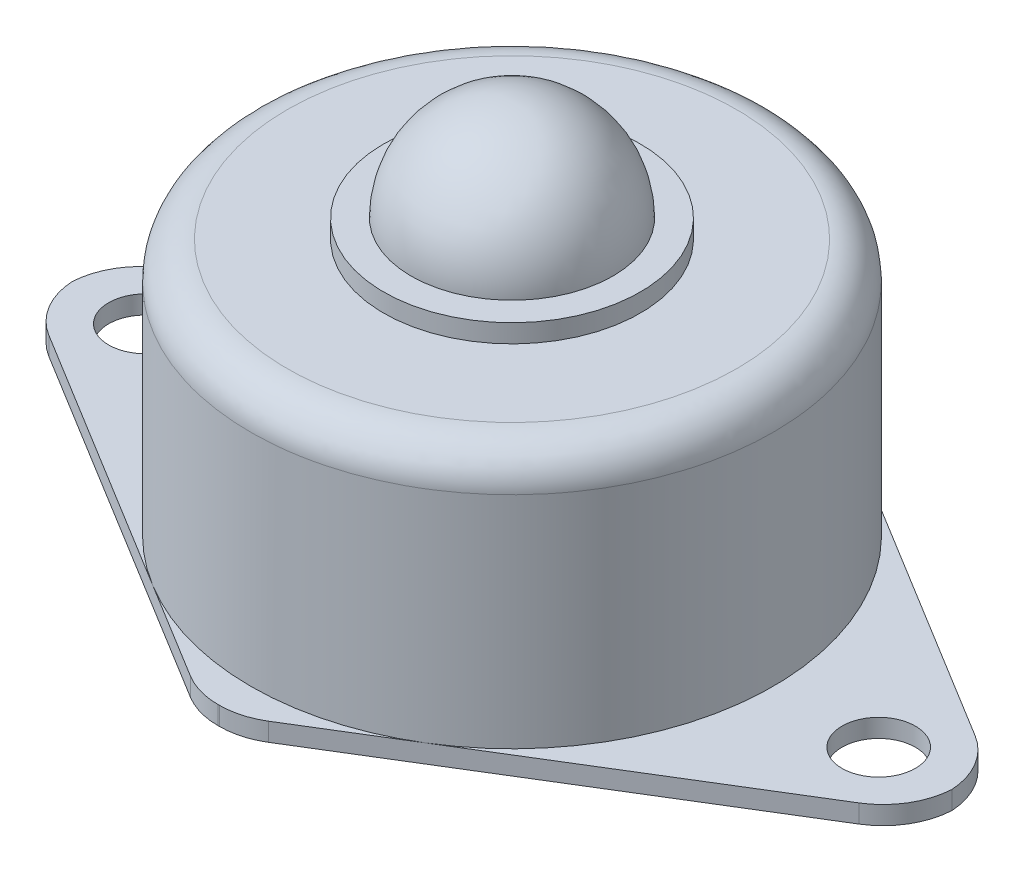
ISO-10303-21;
HEADER;
FILE_DESCRIPTION(('STEP AP214'),'2;1');
FILE_NAME('part.step','',(''),(''),'','','');
FILE_SCHEMA(('AUTOMOTIVE_DESIGN { 1 0 10303 214 1 1 1 1 }'));
ENDSEC;
DATA;
#1=APPLICATION_CONTEXT('core data for automotive mechanical design processes');
#2=APPLICATION_PROTOCOL_DEFINITION('international standard','automotive_design',2000,#1);
#3=PRODUCT_CONTEXT('',#1,'mechanical');
#4=PRODUCT('Part','Part','',(#3));
#5=PRODUCT_RELATED_PRODUCT_CATEGORY('part','',(#4));
#6=PRODUCT_DEFINITION_FORMATION('','',#4);
#7=PRODUCT_DEFINITION_CONTEXT('part definition',#1,'design');
#8=PRODUCT_DEFINITION('design','',#6,#7);
#9=PRODUCT_DEFINITION_SHAPE('','',#8);
#10=(LENGTH_UNIT() NAMED_UNIT(*) SI_UNIT(.MILLI.,.METRE.));
#11=(NAMED_UNIT(*) PLANE_ANGLE_UNIT() SI_UNIT($,.RADIAN.));
#12=(NAMED_UNIT(*) SI_UNIT($,.STERADIAN.) SOLID_ANGLE_UNIT());
#13=UNCERTAINTY_MEASURE_WITH_UNIT(LENGTH_MEASURE(1.E-05),#10,'distance_accuracy_value','');
#14=(GEOMETRIC_REPRESENTATION_CONTEXT(3) GLOBAL_UNCERTAINTY_ASSIGNED_CONTEXT((#13)) GLOBAL_UNIT_ASSIGNED_CONTEXT((#10,
#11,#12)) REPRESENTATION_CONTEXT('',''));
#15=CARTESIAN_POINT('',(0.,0.,0.));
#16=DIRECTION('',(0.,0.,1.));
#17=DIRECTION('',(1.,0.,0.));
#18=AXIS2_PLACEMENT_3D('',#15,#16,#17);
#19=CARTESIAN_POINT('',(0.,20.5,0.));
#20=DIRECTION('',(0.,1.,0.));
#21=DIRECTION('',(-1.,0.,0.));
#22=AXIS2_PLACEMENT_3D('',#19,#20,#21);
#23=CYLINDRICAL_SURFACE('',#22,14.25);
#24=CARTESIAN_POINT('',(-14.25,12.,0.));
#25=CARTESIAN_POINT('',(-14.25,12.,1.86532063653613));
#26=CARTESIAN_POINT('',(-13.8791106419374,12.,3.72990735353475));
#27=CARTESIAN_POINT('',(-12.4514560346343,12.,7.17657046887031));
#28=CARTESIAN_POINT('',(-11.3952525030937,12.,8.75729076072287));
#29=CARTESIAN_POINT('',(-8.75729076072287,12.,11.3952525030937));
#30=CARTESIAN_POINT('',(-7.1765704688717,12.,12.4514560346337));
#31=CARTESIAN_POINT('',(-3.72990735353334,12.,13.879110641938));
#32=CARTESIAN_POINT('',(-1.86532063653795,12.,14.25));
#33=CARTESIAN_POINT('',(1.86532063653795,12.,14.25));
#34=CARTESIAN_POINT('',(3.72990735353417,12.,13.8791106419376));
#35=CARTESIAN_POINT('',(7.17657046887091,12.,12.451456034634));
#36=CARTESIAN_POINT('',(8.75729076072659,12.,11.39525250309));
#37=CARTESIAN_POINT('',(11.39525250309,12.,8.75729076072657));
#38=CARTESIAN_POINT('',(12.4514560346343,12.,7.17657046887035));
#39=CARTESIAN_POINT('',(13.8791106419374,12.,3.72990735353475));
#40=CARTESIAN_POINT('',(14.25,12.,1.86532063653205));
#41=CARTESIAN_POINT('',(14.25,12.,-1.86532063653205));
#42=CARTESIAN_POINT('',(13.8791106419372,12.,-3.72990735353528));
#43=CARTESIAN_POINT('',(12.4514560346345,12.,-7.17657046886973));
#44=CARTESIAN_POINT('',(11.3952525030949,11.9999999999984,-8.75729076072172));
#45=CARTESIAN_POINT('',(8.75729076072173,12.0000000000016,-11.3952525030949));
#46=CARTESIAN_POINT('',(7.17657046885975,12.,-12.4514560346387));
#47=CARTESIAN_POINT('',(3.72990735354535,12.,-13.879110641933));
#48=CARTESIAN_POINT('',(1.86532063653793,12.,-14.25));
#49=CARTESIAN_POINT('',(-1.86532063653797,12.,-14.25));
#50=CARTESIAN_POINT('',(-3.72990735353404,12.,-13.8791106419377));
#51=CARTESIAN_POINT('',(-7.17657046887097,12.,-12.451456034634));
#52=CARTESIAN_POINT('',(-8.75729076072628,12.,-11.3952525030903));
#53=CARTESIAN_POINT('',(-11.3952525030903,12.,-8.75729076072635));
#54=CARTESIAN_POINT('',(-12.4514560346342,12.,-7.17657046887044));
#55=CARTESIAN_POINT('',(-13.8791106419374,12.,-3.72990735353466));
#56=CARTESIAN_POINT('',(-14.25,12.,-1.86532063653613));
#57=CARTESIAN_POINT('',(-14.25,12.,0.));
#58=(BOUNDED_CURVE() B_SPLINE_CURVE(3,(#24,#25,#26,#27,#28,#29,#30,#31,#32,#33,#34,#35,#36,#37,
#38,#39,#40,#41,#42,#43,#44,#45,#46,#47,#48,#49,#50,#51,#52,#53,#54,#55,#56,#57),.UNSPECIFIED.,
.T.,.F.) B_SPLINE_CURVE_WITH_KNOTS((4,2,2,2,2,2,2,2,2,2,2,2,2,2,2,2,4),(0.,0.392699081698724,
0.785398163397448,1.17809724509617,1.5707963267949,1.96349540849362,2.35619449019234,
2.74889357189107,3.14159265358979,3.53429173528852,3.92699081698724,4.31968989868597,
4.71238898038469,5.10508806208341,5.49778714378214,5.89048622548086,6.28318530717959),
.UNSPECIFIED.) CURVE() GEOMETRIC_REPRESENTATION_ITEM() RATIONAL_B_SPLINE_CURVE((1.,1.,1.,1.,1.,
1.,1.,1.,1.,1.,1.,1.,1.,1.,1.,1.,1.,1.,1.,1.,1.,1.,1.,1.,1.,1.,1.,1.,1.,1.,1.,1.,1.,1.)) REPRESENTATION_ITEM(''));
#59=CARTESIAN_POINT('',(-14.25,12.,0.));
#60=VERTEX_POINT('',#59);
#61=EDGE_CURVE('E190',#60,#60,#58,.F.);
#62=ORIENTED_EDGE('',*,*,#61,.T.);
#63=EDGE_LOOP('',(#62));
#64=FACE_BOUND('',#63,.T.);
#65=CARTESIAN_POINT('',(0.,0.,0.));
#66=DIRECTION('',(0.,1.,0.));
#67=DIRECTION('',(-1.,0.,0.));
#68=AXIS2_PLACEMENT_3D('',#65,#66,#67);
#69=CIRCLE('',#68,14.25);
#70=CARTESIAN_POINT('',(-7.44857925519382,0.,12.1482989376742));
#71=VERTEX_POINT('',#70);
#72=CARTESIAN_POINT('',(7.44857925519382,0.,12.1482989376742));
#73=VERTEX_POINT('',#72);
#74=EDGE_CURVE('E175',#71,#73,#69,.T.);
#75=ORIENTED_EDGE('',*,*,#74,.T.);
#76=CARTESIAN_POINT('',(7.44857925519382,0.,-12.1482989376742));
#77=VERTEX_POINT('',#76);
#78=EDGE_CURVE('E167',#73,#77,#69,.T.);
#79=ORIENTED_EDGE('',*,*,#78,.T.);
#80=CARTESIAN_POINT('',(-7.44857925519382,0.,-12.1482989376742));
#81=VERTEX_POINT('',#80);
#82=EDGE_CURVE('E176',#77,#81,#69,.T.);
#83=ORIENTED_EDGE('',*,*,#82,.T.);
#84=EDGE_CURVE('E187',#81,#71,#69,.T.);
#85=ORIENTED_EDGE('',*,*,#84,.T.);
#86=EDGE_LOOP('',(#75,#79,#83,#85));
#87=FACE_BOUND('',#86,.T.);
#88=ADVANCED_FACE('F37',(#64,#87),#23,.T.);
#89=CARTESIAN_POINT('',(-7.00000000000001,14.,0.));
#90=DIRECTION('',(0.,1.,0.));
#91=DIRECTION('',(-1.,0.,0.));
#92=AXIS2_PLACEMENT_3D('',#89,#90,#91);
#93=PLANE('',#92);
#94=CARTESIAN_POINT('',(-12.25,14.,0.));
#95=CARTESIAN_POINT('',(-12.25,14.,-1.60352124895212));
#96=CARTESIAN_POINT('',(-11.9311652886827,14.,-3.20641158461705));
#97=CARTESIAN_POINT('',(-10.7038832578438,14.,-6.16933250832768));
#98=CARTESIAN_POINT('',(-9.79591881844689,14.,-7.52819732062353));
#99=CARTESIAN_POINT('',(-7.52819732062347,14.,-9.79591881844694));
#100=CARTESIAN_POINT('',(-6.16933250832764,14.,-10.7038832578422));
#101=CARTESIAN_POINT('',(-3.20641158461702,14.,-11.9311652886843));
#102=CARTESIAN_POINT('',(-1.60352124895408,14.,-12.25));
#103=CARTESIAN_POINT('',(1.60352124895404,14.,-12.25));
#104=CARTESIAN_POINT('',(3.20641158461786,14.,-11.9311652886827));
#105=CARTESIAN_POINT('',(6.16933250832687,14.,-10.7038832578438));
#106=CARTESIAN_POINT('',(7.52819732062096,14.,-9.79591881844622));
#107=CARTESIAN_POINT('',(9.79591881844945,14.,-7.52819732062421));
#108=CARTESIAN_POINT('',(10.7038832578445,14.,-6.16933250832798));
#109=CARTESIAN_POINT('',(11.9311652886821,14.,-3.20641158461669));
#110=CARTESIAN_POINT('',(12.25,14.,-1.60352124895367));
#111=CARTESIAN_POINT('',(12.25,14.,1.60352124895368));
#112=CARTESIAN_POINT('',(11.9311652886821,14.,3.20641158461753));
#113=CARTESIAN_POINT('',(10.7038832578445,14.,6.1693325083272));
#114=CARTESIAN_POINT('',(9.79591881844622,14.,7.5281973206242));
#115=CARTESIAN_POINT('',(7.52819732062421,14.,9.79591881844621));
#116=CARTESIAN_POINT('',(6.16933250832719,14.,10.7038832578428));
#117=CARTESIAN_POINT('',(3.20641158461752,14.,11.9311652886837));
#118=CARTESIAN_POINT('',(1.60352124895362,14.,12.25));
#119=CARTESIAN_POINT('',(-1.60352124895361,14.,12.25));
#120=CARTESIAN_POINT('',(-3.20641158461589,14.,11.9311652886821));
#121=CARTESIAN_POINT('',(-6.1693325083288,14.,10.7038832578445));
#122=CARTESIAN_POINT('',(-7.52819732062241,14.,9.79591881844801));
#123=CARTESIAN_POINT('',(-9.79591881844801,14.,7.52819732062241));
#124=CARTESIAN_POINT('',(-10.703883257844,14.,6.16933250832755));
#125=CARTESIAN_POINT('',(-11.9311652886826,14.,3.20641158461715));
#126=CARTESIAN_POINT('',(-12.25,14.,1.60352124895211));
#127=CARTESIAN_POINT('',(-12.25,14.,0.));
#128=(BOUNDED_CURVE() B_SPLINE_CURVE(3,(#94,#95,#96,#97,#98,#99,#100,#101,#102,#103,#104,#105,
#106,#107,#108,#109,#110,#111,#112,#113,#114,#115,#116,#117,#118,#119,#120,#121,#122,#123,#124,
#125,#126,#127),.UNSPECIFIED.,.T.,.F.) B_SPLINE_CURVE_WITH_KNOTS((4,2,2,2,2,2,2,2,2,2,2,2,2,2,2,
2,4),(0.,0.392699081698725,0.785398163397448,1.17809724509617,1.5707963267949,1.96349540849362,
2.35619449019234,2.74889357189107,3.14159265358979,3.53429173528852,3.92699081698724,
4.31968989868597,4.71238898038469,5.10508806208341,5.49778714378214,5.89048622548086,
6.28318530717959),
.UNSPECIFIED.) CURVE() GEOMETRIC_REPRESENTATION_ITEM() RATIONAL_B_SPLINE_CURVE((1.,1.,1.,1.,1.,
1.,1.,1.,1.,1.,1.,1.,1.,1.,1.,1.,1.,1.,1.,1.,1.,1.,1.,1.,1.,1.,1.,1.,1.,1.,1.,1.,1.,1.)) REPRESENTATION_ITEM(''));
#129=CARTESIAN_POINT('',(-12.25,14.,0.));
#130=VERTEX_POINT('',#129);
#131=EDGE_CURVE('E188',#130,#130,#128,.F.);
#132=ORIENTED_EDGE('',*,*,#131,.T.);
#133=EDGE_LOOP('',(#132));
#134=FACE_BOUND('',#133,.T.);
#135=CARTESIAN_POINT('',(0.,14.,0.));
#136=DIRECTION('',(0.,1.,0.));
#137=DIRECTION('',(-1.,0.,0.));
#138=AXIS2_PLACEMENT_3D('',#135,#136,#137);
#139=CIRCLE('',#138,7.00000000000001);
#140=CARTESIAN_POINT('',(-7.00000000000001,14.,0.));
#141=VERTEX_POINT('',#140);
#142=EDGE_CURVE('E193',#141,#141,#139,.T.);
#143=ORIENTED_EDGE('',*,*,#142,.F.);
#144=EDGE_LOOP('',(#143));
#145=FACE_BOUND('',#144,.T.);
#146=ADVANCED_FACE('F357',(#134,#145),#93,.T.);
#147=CARTESIAN_POINT('',(0.,20.5,0.));
#148=DIRECTION('',(0.,1.,0.));
#149=DIRECTION('',(-1.,0.,0.));
#150=AXIS2_PLACEMENT_3D('',#147,#148,#149);
#151=CYLINDRICAL_SURFACE('',#150,7.00000000000001);
#152=ORIENTED_EDGE('',*,*,#142,.T.);
#153=EDGE_LOOP('',(#152));
#154=FACE_BOUND('',#153,.T.);
#155=CARTESIAN_POINT('',(0.,15.,0.));
#156=DIRECTION('',(0.,1.,0.));
#157=DIRECTION('',(-1.,0.,0.));
#158=AXIS2_PLACEMENT_3D('',#155,#156,#157);
#159=CIRCLE('',#158,7.00000000000001);
#160=CARTESIAN_POINT('',(-7.00000000000001,15.,0.));
#161=VERTEX_POINT('',#160);
#162=EDGE_CURVE('E195',#161,#161,#159,.T.);
#163=ORIENTED_EDGE('',*,*,#162,.F.);
#164=EDGE_LOOP('',(#163));
#165=FACE_BOUND('',#164,.T.);
#166=ADVANCED_FACE('F363',(#154,#165),#151,.T.);
#167=CARTESIAN_POINT('',(-5.50000000000001,15.,0.));
#168=DIRECTION('',(0.,1.,0.));
#169=DIRECTION('',(-1.,0.,0.));
#170=AXIS2_PLACEMENT_3D('',#167,#168,#169);
#171=PLANE('',#170);
#172=ORIENTED_EDGE('',*,*,#162,.T.);
#173=EDGE_LOOP('',(#172));
#174=FACE_BOUND('',#173,.T.);
#175=CARTESIAN_POINT('',(0.,15.,0.));
#176=DIRECTION('',(0.,1.,0.));
#177=DIRECTION('',(-1.,0.,0.));
#178=AXIS2_PLACEMENT_3D('',#175,#176,#177);
#179=CIRCLE('',#178,5.50000000000001);
#180=CARTESIAN_POINT('',(-5.50000000000001,15.,0.));
#181=VERTEX_POINT('',#180);
#182=EDGE_CURVE('E199',#181,#181,#179,.T.);
#183=ORIENTED_EDGE('',*,*,#182,.F.);
#184=EDGE_LOOP('',(#183));
#185=FACE_BOUND('',#184,.T.);
#186=ADVANCED_FACE('F405',(#174,#185),#171,.T.);
#187=CARTESIAN_POINT('',(0.,15.,0.));
#188=DIRECTION('',(0.,1.,0.));
#189=DIRECTION('',(1.,0.,0.));
#190=AXIS2_PLACEMENT_3D('',#187,#188,#189);
#191=SPHERICAL_SURFACE('',#190,5.5);
#192=ORIENTED_EDGE('',*,*,#182,.T.);
#193=EDGE_LOOP('',(#192));
#194=FACE_BOUND('',#193,.T.);
#195=ADVANCED_FACE('F398',(#194),#191,.T.);
#196=CARTESIAN_POINT('',(-12.25,14.,0.));
#197=CARTESIAN_POINT('',(-12.25,14.,1.60352124895211));
#198=CARTESIAN_POINT('',(-11.9311652886826,14.,3.20641158461715));
#199=CARTESIAN_POINT('',(-10.703883257844,14.,6.16933250832755));
#200=CARTESIAN_POINT('',(-9.79591881844801,14.,7.52819732062241));
#201=CARTESIAN_POINT('',(-7.52819732062241,14.,9.79591881844801));
#202=CARTESIAN_POINT('',(-6.1693325083288,14.,10.7038832578445));
#203=CARTESIAN_POINT('',(-3.20641158461589,14.,11.9311652886821));
#204=CARTESIAN_POINT('',(-1.60352124895361,14.,12.25));
#205=CARTESIAN_POINT('',(1.60352124895362,14.,12.25));
#206=CARTESIAN_POINT('',(3.20641158461752,14.,11.9311652886837));
#207=CARTESIAN_POINT('',(6.16933250832719,14.,10.7038832578428));
#208=CARTESIAN_POINT('',(7.52819732062421,14.,9.79591881844621));
#209=CARTESIAN_POINT('',(9.79591881844622,14.,7.5281973206242));
#210=CARTESIAN_POINT('',(10.7038832578445,14.,6.1693325083272));
#211=CARTESIAN_POINT('',(11.9311652886821,14.,3.20641158461753));
#212=CARTESIAN_POINT('',(12.25,14.,1.60352124895368));
#213=CARTESIAN_POINT('',(12.25,14.,-1.60352124895367));
#214=CARTESIAN_POINT('',(11.9311652886821,14.,-3.20641158461669));
#215=CARTESIAN_POINT('',(10.7038832578445,14.,-6.16933250832798));
#216=CARTESIAN_POINT('',(9.79591881844945,14.,-7.52819732062421));
#217=CARTESIAN_POINT('',(7.52819732062096,14.,-9.79591881844622));
#218=CARTESIAN_POINT('',(6.16933250832687,14.,-10.7038832578438));
#219=CARTESIAN_POINT('',(3.20641158461786,14.,-11.9311652886827));
#220=CARTESIAN_POINT('',(1.60352124895404,14.,-12.25));
#221=CARTESIAN_POINT('',(-1.60352124895408,14.,-12.25));
#222=CARTESIAN_POINT('',(-3.20641158461702,14.,-11.9311652886843));
#223=CARTESIAN_POINT('',(-6.16933250832764,14.,-10.7038832578422));
#224=CARTESIAN_POINT('',(-7.52819732062347,14.,-9.79591881844694));
#225=CARTESIAN_POINT('',(-9.79591881844689,14.,-7.52819732062353));
#226=CARTESIAN_POINT('',(-10.7038832578438,14.,-6.16933250832768));
#227=CARTESIAN_POINT('',(-11.9311652886827,14.,-3.20641158461705));
#228=CARTESIAN_POINT('',(-12.25,14.,-1.60352124895212));
#229=CARTESIAN_POINT('',(-12.25,14.,0.));
#230=CARTESIAN_POINT('',(-14.25,14.,0.));
#231=CARTESIAN_POINT('',(-14.25,14.,1.86532063653613));
#232=CARTESIAN_POINT('',(-13.879110641937,14.,3.72990735353458));
#233=CARTESIAN_POINT('',(-12.4514560346347,14.,7.17657046887048));
#234=CARTESIAN_POINT('',(-11.3952525030937,14.,8.75729076072287));
#235=CARTESIAN_POINT('',(-8.75729076072287,14.,11.3952525030937));
#236=CARTESIAN_POINT('',(-7.17657046887234,14.,12.4514560346353));
#237=CARTESIAN_POINT('',(-3.7299073535327,14.,13.8791106419364));
#238=CARTESIAN_POINT('',(-1.86532063653789,14.,14.25));
#239=CARTESIAN_POINT('',(1.86532063653789,14.,14.25));
#240=CARTESIAN_POINT('',(3.72990735353514,14.0000000000016,13.879110641938));
#241=CARTESIAN_POINT('',(7.17657046886993,13.9999999999984,12.4514560346336));
#242=CARTESIAN_POINT('',(8.75729076072658,14.,11.39525250309));
#243=CARTESIAN_POINT('',(11.39525250309,14.,8.75729076072657));
#244=CARTESIAN_POINT('',(12.4514560346353,14.,7.17657046887075));
#245=CARTESIAN_POINT('',(13.8791106419364,14.,3.72990735353435));
#246=CARTESIAN_POINT('',(14.25,14.,1.86532063653205));
#247=CARTESIAN_POINT('',(14.25,14.,-1.86532063653205));
#248=CARTESIAN_POINT('',(13.8791106419348,14.,-3.7299073535343));
#249=CARTESIAN_POINT('',(12.4514560346369,14.,-7.17657046887071));
#250=CARTESIAN_POINT('',(11.3952525030965,13.9999999999968,-8.75729076072334));
#251=CARTESIAN_POINT('',(8.7572907607201,14.0000000000032,-11.3952525030933));
#252=CARTESIAN_POINT('',(7.17657046885901,14.,-12.4514560346388));
#253=CARTESIAN_POINT('',(3.72990735354609,14.,-13.8791106419328));
#254=CARTESIAN_POINT('',(1.86532063653831,14.,-14.25));
#255=CARTESIAN_POINT('',(-1.86532063653835,14.,-14.25));
#256=CARTESIAN_POINT('',(-3.72990735353472,14.,-13.8791106419393));
#257=CARTESIAN_POINT('',(-7.17657046887029,14.,-12.4514560346324));
#258=CARTESIAN_POINT('',(-8.75729076072629,14.,-11.3952525030903));
#259=CARTESIAN_POINT('',(-11.3952525030903,14.,-8.75729076072635));
#260=CARTESIAN_POINT('',(-12.451456034634,13.9999999999984,-7.17657046886952));
#261=CARTESIAN_POINT('',(-13.8791106419377,14.0000000000016,-3.72990735353558));
#262=CARTESIAN_POINT('',(-14.25,14.,-1.86532063653613));
#263=CARTESIAN_POINT('',(-14.25,14.,0.));
#264=CARTESIAN_POINT('',(-14.25,12.,0.));
#265=CARTESIAN_POINT('',(-14.25,12.,1.86532063653613));
#266=CARTESIAN_POINT('',(-13.8791106419374,12.,3.72990735353475));
#267=CARTESIAN_POINT('',(-12.4514560346343,12.,7.17657046887031));
#268=CARTESIAN_POINT('',(-11.3952525030937,12.,8.75729076072287));
#269=CARTESIAN_POINT('',(-8.75729076072287,12.,11.3952525030937));
#270=CARTESIAN_POINT('',(-7.1765704688717,12.,12.4514560346337));
#271=CARTESIAN_POINT('',(-3.72990735353334,12.,13.879110641938));
#272=CARTESIAN_POINT('',(-1.86532063653795,12.,14.25));
#273=CARTESIAN_POINT('',(1.86532063653795,12.,14.25));
#274=CARTESIAN_POINT('',(3.72990735353417,12.,13.8791106419376));
#275=CARTESIAN_POINT('',(7.17657046887091,12.,12.451456034634));
#276=CARTESIAN_POINT('',(8.75729076072659,12.,11.39525250309));
#277=CARTESIAN_POINT('',(11.39525250309,12.,8.75729076072657));
#278=CARTESIAN_POINT('',(12.4514560346343,12.,7.17657046887035));
#279=CARTESIAN_POINT('',(13.8791106419374,12.,3.72990735353475));
#280=CARTESIAN_POINT('',(14.25,12.,1.86532063653205));
#281=CARTESIAN_POINT('',(14.25,12.,-1.86532063653205));
#282=CARTESIAN_POINT('',(13.8791106419372,12.,-3.72990735353528));
#283=CARTESIAN_POINT('',(12.4514560346345,12.,-7.17657046886973));
#284=CARTESIAN_POINT('',(11.3952525030949,11.9999999999984,-8.75729076072172));
#285=CARTESIAN_POINT('',(8.75729076072173,12.0000000000016,-11.3952525030949));
#286=CARTESIAN_POINT('',(7.17657046885975,12.,-12.4514560346387));
#287=CARTESIAN_POINT('',(3.72990735354535,12.,-13.879110641933));
#288=CARTESIAN_POINT('',(1.86532063653793,12.,-14.25));
#289=CARTESIAN_POINT('',(-1.86532063653797,12.,-14.25));
#290=CARTESIAN_POINT('',(-3.72990735353404,12.,-13.8791106419377));
#291=CARTESIAN_POINT('',(-7.17657046887097,12.,-12.451456034634));
#292=CARTESIAN_POINT('',(-8.75729076072628,12.,-11.3952525030903));
#293=CARTESIAN_POINT('',(-11.3952525030903,12.,-8.75729076072635));
#294=CARTESIAN_POINT('',(-12.4514560346342,12.,-7.17657046887044));
#295=CARTESIAN_POINT('',(-13.8791106419374,12.,-3.72990735353466));
#296=CARTESIAN_POINT('',(-14.25,12.,-1.86532063653613));
#297=CARTESIAN_POINT('',(-14.25,12.,0.));
#298=(BOUNDED_SURFACE() B_SPLINE_SURFACE(2,3,((#196,#197,#198,#199,#200,#201,#202,#203,#204,
#205,#206,#207,#208,#209,#210,#211,#212,#213,#214,#215,#216,#217,#218,#219,#220,#221,#222,#223,
#224,#225,#226,#227,#228,#229),(#230,#231,#232,#233,#234,#235,#236,#237,#238,#239,#240,#241,
#242,#243,#244,#245,#246,#247,#248,#249,#250,#251,#252,#253,#254,#255,#256,#257,#258,#259,#260,
#261,#262,#263),(#264,#265,#266,#267,#268,#269,#270,#271,#272,#273,#274,#275,#276,#277,#278,
#279,#280,#281,#282,#283,#284,#285,#286,#287,#288,#289,#290,#291,#292,#293,#294,#295,#296,
#297)),.UNSPECIFIED.,.F.,.T.,.F.) B_SPLINE_SURFACE_WITH_KNOTS((3,3),(4,2,2,2,2,2,2,2,2,2,2,2,2,
2,2,2,4),(0.,1.),(0.,0.392699081698724,0.785398163397448,1.17809724509617,1.5707963267949,
1.96349540849362,2.35619449019234,2.74889357189107,3.14159265358979,3.53429173528852,
3.92699081698724,4.31968989868597,4.71238898038469,5.10508806208341,5.49778714378214,
5.89048622548086,6.28318530717959),
.UNSPECIFIED.) GEOMETRIC_REPRESENTATION_ITEM() RATIONAL_B_SPLINE_SURFACE(((1.,1.,1.,1.,1.,1.,1.,
1.,1.,1.,1.,1.,1.,1.,1.,1.,1.,1.,1.,1.,1.,1.,1.,1.,1.,1.,1.,1.,1.,1.,1.,1.,1.,1.),
(0.707106781186547,0.707106781186547,0.707106781186548,0.707106781186548,0.707106781186548,
0.707106781186548,0.707106781186548,0.707106781186548,0.707106781186548,0.707106781186548,
0.707106781186548,0.707106781186548,0.707106781186548,0.707106781186548,0.707106781186547,
0.707106781186547,0.707106781186548,0.707106781186548,0.707106781186547,0.707106781186547,
0.707106781186548,0.707106781186548,0.707106781186548,0.707106781186548,0.707106781186548,
0.707106781186548,0.707106781186547,0.707106781186547,0.707106781186548,0.707106781186548,
0.707106781186548,0.707106781186548,0.707106781186547,0.707106781186547),(1.,1.,1.,1.,1.,1.,1.,
1.,1.,1.,1.,1.,1.,1.,1.,1.,1.,1.,1.,1.,1.,1.,1.,1.,1.,1.,1.,1.,1.,1.,1.,1.,1.,1.))) REPRESENTATION_ITEM('') SURFACE());
#299=ORIENTED_EDGE('',*,*,#61,.F.);
#300=EDGE_LOOP('',(#299));
#301=FACE_BOUND('',#300,.T.);
#302=ORIENTED_EDGE('',*,*,#131,.F.);
#303=EDGE_LOOP('',(#302));
#304=FACE_BOUND('',#303,.T.);
#305=ADVANCED_FACE('F369',(#301,#304),#298,.T.);
#306=CARTESIAN_POINT('',(0.,0.,0.));
#307=DIRECTION('',(0.,1.,0.));
#308=DIRECTION('',(0.,0.,1.));
#309=AXIS2_PLACEMENT_3D('',#306,#307,#308);
#310=PLANE('',#309);
#311=DIRECTION('',(-1.,0.,0.));
#312=VECTOR('',#311,1.);
#313=CARTESIAN_POINT('',(0.,0.,16.));
#314=LINE('',#313,#312);
#315=CARTESIAN_POINT('',(0.0379821088313326,0.,16.));
#316=VERTEX_POINT('',#315);
#317=CARTESIAN_POINT('',(-0.0379821088313251,0.,16.));
#318=VERTEX_POINT('',#317);
#319=EDGE_CURVE('E185',#316,#318,#314,.T.);
#320=ORIENTED_EDGE('',*,*,#319,.F.);
#321=CARTESIAN_POINT('',(0.0379821088313328,0.,12.));
#322=DIRECTION('',(0.,1.,0.));
#323=DIRECTION('',(0.,0.,1.));
#324=AXIS2_PLACEMENT_3D('',#321,#322,#323);
#325=CIRCLE('',#324,4.);
#326=CARTESIAN_POINT('',(2.12881137344714,0.,15.4100488246103));
#327=VERTEX_POINT('',#326);
#328=EDGE_CURVE('E184',#316,#327,#325,.T.);
#329=ORIENTED_EDGE('',*,*,#328,.T.);
#330=DIRECTION('',(-0.852512206152576,0.,0.522707316153952));
#331=VECTOR('',#330,1.);
#332=CARTESIAN_POINT('',(7.44857925519382,0.,12.1482989376742));
#333=LINE('',#332,#331);
#334=EDGE_CURVE('E158',#73,#327,#333,.T.);
#335=ORIENTED_EDGE('',*,*,#334,.F.);
#336=ORIENTED_EDGE('',*,*,#74,.F.);
#337=DIRECTION('',(0.852512206152576,0.,0.522707316153952));
#338=VECTOR('',#337,1.);
#339=CARTESIAN_POINT('',(-7.44857925519382,0.,12.1482989376742));
#340=LINE('',#339,#338);
#341=CARTESIAN_POINT('',(-2.12881137344713,0.,15.4100488246103));
#342=VERTEX_POINT('',#341);
#343=EDGE_CURVE('E222',#71,#342,#340,.T.);
#344=ORIENTED_EDGE('',*,*,#343,.T.);
#345=CARTESIAN_POINT('',(-0.0379821088313248,0.,12.));
#346=DIRECTION('',(0.,1.,0.));
#347=DIRECTION('',(0.,0.,1.));
#348=AXIS2_PLACEMENT_3D('',#345,#346,#347);
#349=CIRCLE('',#348,4.);
#350=EDGE_CURVE('E261',#342,#318,#349,.T.);
#351=ORIENTED_EDGE('',*,*,#350,.T.);
#352=EDGE_LOOP('',(#320,#329,#335,#336,#344,#351));
#353=FACE_BOUND('',#352,.T.);
#354=ADVANCED_FACE('F181',(#353),#310,.T.);
#355=CARTESIAN_POINT('',(20.,0.,0.));
#356=DIRECTION('',(0.,1.,0.));
#357=DIRECTION('',(0.,0.,1.));
#358=AXIS2_PLACEMENT_3D('',#355,#356,#357);
#359=CIRCLE('',#358,2.);
#360=CARTESIAN_POINT('',(20.,0.,2.));
#361=VERTEX_POINT('',#360);
#362=EDGE_CURVE('E205',#361,#361,#359,.F.);
#363=ORIENTED_EDGE('',*,*,#362,.T.);
#364=EDGE_LOOP('',(#363));
#365=FACE_BOUND('',#364,.T.);
#366=CARTESIAN_POINT('',(20.,0.,-0.239464398991251));
#367=DIRECTION('',(0.,1.,0.));
#368=DIRECTION('',(0.,0.,1.));
#369=AXIS2_PLACEMENT_3D('',#366,#367,#368);
#370=CIRCLE('',#369,4.);
#371=CARTESIAN_POINT('',(22.0908292646158,0.,3.17058442561905));
#372=VERTEX_POINT('',#371);
#373=CARTESIAN_POINT('',(23.992825666319,0.,0.));
#374=VERTEX_POINT('',#373);
#375=EDGE_CURVE('E329',#372,#374,#370,.T.);
#376=ORIENTED_EDGE('',*,*,#375,.T.);
#377=CARTESIAN_POINT('',(20.,0.,0.239464398991252));
#378=DIRECTION('',(0.,1.,0.));
#379=DIRECTION('',(0.,0.,1.));
#380=AXIS2_PLACEMENT_3D('',#377,#378,#379);
#381=CIRCLE('',#380,4.);
#382=CARTESIAN_POINT('',(22.0908292646158,0.,-3.17058442561905));
#383=VERTEX_POINT('',#382);
#384=EDGE_CURVE('E330',#374,#383,#381,.T.);
#385=ORIENTED_EDGE('',*,*,#384,.T.);
#386=DIRECTION('',(-0.852512206152576,0.,-0.522707316153952));
#387=VECTOR('',#386,1.);
#388=CARTESIAN_POINT('',(7.44857925519382,0.,-12.1482989376742));
#389=LINE('',#388,#387);
#390=EDGE_CURVE('E170',#383,#77,#389,.T.);
#391=ORIENTED_EDGE('',*,*,#390,.T.);
#392=ORIENTED_EDGE('',*,*,#78,.F.);
#393=EDGE_CURVE('E153',#372,#73,#333,.T.);
#394=ORIENTED_EDGE('',*,*,#393,.F.);
#395=EDGE_LOOP('',(#376,#385,#391,#392,#394));
#396=FACE_BOUND('',#395,.T.);
#397=ADVANCED_FACE('F168',(#365,#396),#310,.T.);
#398=CARTESIAN_POINT('',(2.12881137344714,0.,-15.4100488246103));
#399=VERTEX_POINT('',#398);
#400=EDGE_CURVE('E164',#77,#399,#389,.T.);
#401=ORIENTED_EDGE('',*,*,#400,.T.);
#402=CARTESIAN_POINT('',(0.0379821088313326,0.,-12.));
#403=DIRECTION('',(0.,1.,0.));
#404=DIRECTION('',(0.,0.,1.));
#405=AXIS2_PLACEMENT_3D('',#402,#403,#404);
#406=CIRCLE('',#405,4.);
#407=CARTESIAN_POINT('',(0.0379821088313326,0.,-16.));
#408=VERTEX_POINT('',#407);
#409=EDGE_CURVE('E62',#399,#408,#406,.T.);
#410=ORIENTED_EDGE('',*,*,#409,.T.);
#411=DIRECTION('',(-1.,0.,0.));
#412=VECTOR('',#411,1.);
#413=CARTESIAN_POINT('',(0.,0.,-16.));
#414=LINE('',#413,#412);
#415=CARTESIAN_POINT('',(-0.0379821088313254,0.,-16.));
#416=VERTEX_POINT('',#415);
#417=EDGE_CURVE('E215',#408,#416,#414,.T.);
#418=ORIENTED_EDGE('',*,*,#417,.T.);
#419=CARTESIAN_POINT('',(-0.0379821088313254,0.,-12.));
#420=DIRECTION('',(0.,1.,0.));
#421=DIRECTION('',(0.,0.,1.));
#422=AXIS2_PLACEMENT_3D('',#419,#420,#421);
#423=CIRCLE('',#422,4.);
#424=CARTESIAN_POINT('',(-2.12881137344713,0.,-15.4100488246103));
#425=VERTEX_POINT('',#424);
#426=EDGE_CURVE('E54',#416,#425,#423,.T.);
#427=ORIENTED_EDGE('',*,*,#426,.T.);
#428=DIRECTION('',(0.852512206152576,0.,-0.522707316153952));
#429=VECTOR('',#428,1.);
#430=CARTESIAN_POINT('',(-7.44857925519382,0.,-12.1482989376742));
#431=LINE('',#430,#429);
#432=EDGE_CURVE('E214',#81,#425,#431,.T.);
#433=ORIENTED_EDGE('',*,*,#432,.F.);
#434=ORIENTED_EDGE('',*,*,#82,.F.);
#435=EDGE_LOOP('',(#401,#410,#418,#427,#433,#434));
#436=FACE_BOUND('',#435,.T.);
#437=ADVANCED_FACE('F485',(#436),#310,.T.);
#438=CARTESIAN_POINT('',(-20.,0.,0.));
#439=DIRECTION('',(0.,1.,0.));
#440=DIRECTION('',(0.,0.,1.));
#441=AXIS2_PLACEMENT_3D('',#438,#439,#440);
#442=CIRCLE('',#441,2.);
#443=CARTESIAN_POINT('',(-20.,0.,2.));
#444=VERTEX_POINT('',#443);
#445=EDGE_CURVE('E209',#444,#444,#442,.T.);
#446=ORIENTED_EDGE('',*,*,#445,.F.);
#447=EDGE_LOOP('',(#446));
#448=FACE_BOUND('',#447,.T.);
#449=CARTESIAN_POINT('',(-20.,0.,0.23946439899126));
#450=DIRECTION('',(0.,1.,0.));
#451=DIRECTION('',(0.,0.,1.));
#452=AXIS2_PLACEMENT_3D('',#449,#450,#451);
#453=CIRCLE('',#452,4.);
#454=CARTESIAN_POINT('',(-22.0908292646158,0.,-3.17058442561904));
#455=VERTEX_POINT('',#454);
#456=CARTESIAN_POINT('',(-23.992825666319,0.,0.));
#457=VERTEX_POINT('',#456);
#458=EDGE_CURVE('E262',#455,#457,#453,.T.);
#459=ORIENTED_EDGE('',*,*,#458,.T.);
#460=CARTESIAN_POINT('',(-20.,0.,-0.23946439899126));
#461=DIRECTION('',(0.,1.,0.));
#462=DIRECTION('',(0.,0.,1.));
#463=AXIS2_PLACEMENT_3D('',#460,#461,#462);
#464=CIRCLE('',#463,4.);
#465=CARTESIAN_POINT('',(-22.0908292646158,0.,3.17058442561904));
#466=VERTEX_POINT('',#465);
#467=EDGE_CURVE('E264',#457,#466,#464,.T.);
#468=ORIENTED_EDGE('',*,*,#467,.T.);
#469=EDGE_CURVE('E220',#466,#71,#340,.T.);
#470=ORIENTED_EDGE('',*,*,#469,.T.);
#471=ORIENTED_EDGE('',*,*,#84,.F.);
#472=EDGE_CURVE('E212',#455,#81,#431,.T.);
#473=ORIENTED_EDGE('',*,*,#472,.F.);
#474=EDGE_LOOP('',(#459,#468,#470,#471,#473));
#475=FACE_BOUND('',#474,.T.);
#476=ADVANCED_FACE('F404',(#448,#475),#310,.T.);
#477=CARTESIAN_POINT('',(-7.44857925519382,-1.,-12.1482989376742));
#478=DIRECTION('',(0.522707316153952,0.,0.852512206152576));
#479=DIRECTION('',(0.852512206152576,0.,-0.522707316153952));
#480=AXIS2_PLACEMENT_3D('',#477,#478,#479);
#481=PLANE('',#480);
#482=DIRECTION('',(0.852512206152576,0.,-0.522707316153952));
#483=VECTOR('',#482,1.);
#484=CARTESIAN_POINT('',(-7.44857925519382,-1.,-12.1482989376742));
#485=LINE('',#484,#483);
#486=CARTESIAN_POINT('',(-22.0908292646158,-1.,-3.17058442561904));
#487=VERTEX_POINT('',#486);
#488=CARTESIAN_POINT('',(-2.12881137344713,-1.,-15.4100488246103));
#489=VERTEX_POINT('',#488);
#490=EDGE_CURVE('E228',#487,#489,#485,.T.);
#491=ORIENTED_EDGE('',*,*,#490,.F.);
#492=DIRECTION('',(0.,1.,0.));
#493=VECTOR('',#492,1.);
#494=CARTESIAN_POINT('',(-22.0908292646158,0.,-3.17058442561905));
#495=LINE('',#494,#493);
#496=EDGE_CURVE('E272',#487,#455,#495,.T.);
#497=ORIENTED_EDGE('',*,*,#496,.T.);
#498=ORIENTED_EDGE('',*,*,#472,.T.);
#499=ORIENTED_EDGE('',*,*,#432,.T.);
#500=DIRECTION('',(0.,1.,0.));
#501=VECTOR('',#500,1.);
#502=CARTESIAN_POINT('',(-2.12881137344713,-1.,-15.4100488246103));
#503=LINE('',#502,#501);
#504=EDGE_CURVE('E270',#425,#489,#503,.F.);
#505=ORIENTED_EDGE('',*,*,#504,.T.);
#506=EDGE_LOOP('',(#491,#497,#498,#499,#505));
#507=FACE_BOUND('',#506,.T.);
#508=ADVANCED_FACE('F501',(#507),#481,.F.);
#509=CARTESIAN_POINT('',(0.,-1.,-16.));
#510=DIRECTION('',(0.,0.,-1.));
#511=DIRECTION('',(-1.,0.,0.));
#512=AXIS2_PLACEMENT_3D('',#509,#510,#511);
#513=PLANE('',#512);
#514=ORIENTED_EDGE('',*,*,#417,.F.);
#515=DIRECTION('',(0.,1.,0.));
#516=VECTOR('',#515,1.);
#517=CARTESIAN_POINT('',(0.0379821088313326,-1.,-16.));
#518=LINE('',#517,#516);
#519=CARTESIAN_POINT('',(0.0379821088313326,-1.,-16.));
#520=VERTEX_POINT('',#519);
#521=EDGE_CURVE('E12',#408,#520,#518,.F.);
#522=ORIENTED_EDGE('',*,*,#521,.T.);
#523=DIRECTION('',(-1.,0.,0.));
#524=VECTOR('',#523,1.);
#525=CARTESIAN_POINT('',(0.,-1.,-16.));
#526=LINE('',#525,#524);
#527=CARTESIAN_POINT('',(-0.0379821088313254,-1.,-16.));
#528=VERTEX_POINT('',#527);
#529=EDGE_CURVE('E231',#520,#528,#526,.T.);
#530=ORIENTED_EDGE('',*,*,#529,.T.);
#531=DIRECTION('',(0.,1.,0.));
#532=VECTOR('',#531,1.);
#533=CARTESIAN_POINT('',(-0.0379821088313254,0.,-16.));
#534=LINE('',#533,#532);
#535=EDGE_CURVE('E46',#528,#416,#534,.T.);
#536=ORIENTED_EDGE('',*,*,#535,.T.);
#537=EDGE_LOOP('',(#514,#522,#530,#536));
#538=FACE_BOUND('',#537,.T.);
#539=ADVANCED_FACE('F348',(#538),#513,.T.);
#540=CARTESIAN_POINT('',(7.44857925519382,-1.,-12.1482989376742));
#541=DIRECTION('',(0.522707316153952,0.,-0.852512206152576));
#542=DIRECTION('',(-0.852512206152576,0.,-0.522707316153952));
#543=AXIS2_PLACEMENT_3D('',#540,#541,#542);
#544=PLANE('',#543);
#545=ORIENTED_EDGE('',*,*,#390,.F.);
#546=DIRECTION('',(0.,1.,0.));
#547=VECTOR('',#546,1.);
#548=CARTESIAN_POINT('',(22.0908292646158,-1.,-3.17058442561905));
#549=LINE('',#548,#547);
#550=CARTESIAN_POINT('',(22.0908292646158,-1.,-3.17058442561905));
#551=VERTEX_POINT('',#550);
#552=EDGE_CURVE('E342',#383,#551,#549,.F.);
#553=ORIENTED_EDGE('',*,*,#552,.T.);
#554=DIRECTION('',(-0.852512206152576,0.,-0.522707316153952));
#555=VECTOR('',#554,1.);
#556=CARTESIAN_POINT('',(7.44857925519382,-1.,-12.1482989376742));
#557=LINE('',#556,#555);
#558=CARTESIAN_POINT('',(2.12881137344714,-1.,-15.4100488246103));
#559=VERTEX_POINT('',#558);
#560=EDGE_CURVE('E234',#551,#559,#557,.T.);
#561=ORIENTED_EDGE('',*,*,#560,.T.);
#562=DIRECTION('',(0.,1.,0.));
#563=VECTOR('',#562,1.);
#564=CARTESIAN_POINT('',(2.12881137344714,-1.,-15.4100488246103));
#565=LINE('',#564,#563);
#566=EDGE_CURVE('E332',#559,#399,#565,.T.);
#567=ORIENTED_EDGE('',*,*,#566,.T.);
#568=ORIENTED_EDGE('',*,*,#400,.F.);
#569=EDGE_LOOP('',(#545,#553,#561,#567,#568));
#570=FACE_BOUND('',#569,.T.);
#571=ADVANCED_FACE('F519',(#570),#544,.T.);
#572=CARTESIAN_POINT('',(7.44857925519382,-1.,12.1482989376742));
#573=DIRECTION('',(-0.522707316153952,0.,-0.852512206152576));
#574=DIRECTION('',(-0.852512206152576,0.,0.522707316153952));
#575=AXIS2_PLACEMENT_3D('',#572,#573,#574);
#576=PLANE('',#575);
#577=DIRECTION('',(-0.852512206152576,0.,0.522707316153952));
#578=VECTOR('',#577,1.);
#579=CARTESIAN_POINT('',(7.44857925519382,-1.,12.1482989376742));
#580=LINE('',#579,#578);
#581=CARTESIAN_POINT('',(22.0908292646158,-1.,3.17058442561905));
#582=VERTEX_POINT('',#581);
#583=CARTESIAN_POINT('',(2.12881137344714,-1.,15.4100488246103));
#584=VERTEX_POINT('',#583);
#585=EDGE_CURVE('E237',#582,#584,#580,.T.);
#586=ORIENTED_EDGE('',*,*,#585,.F.);
#587=DIRECTION('',(0.,1.,0.));
#588=VECTOR('',#587,1.);
#589=CARTESIAN_POINT('',(22.0908292646158,-1.,3.17058442561905));
#590=LINE('',#589,#588);
#591=EDGE_CURVE('E161',#582,#372,#590,.T.);
#592=ORIENTED_EDGE('',*,*,#591,.T.);
#593=ORIENTED_EDGE('',*,*,#393,.T.);
#594=ORIENTED_EDGE('',*,*,#334,.T.);
#595=DIRECTION('',(0.,1.,0.));
#596=VECTOR('',#595,1.);
#597=CARTESIAN_POINT('',(2.12881137344714,-1.,15.4100488246103));
#598=LINE('',#597,#596);
#599=EDGE_CURVE('E308',#327,#584,#598,.F.);
#600=ORIENTED_EDGE('',*,*,#599,.T.);
#601=EDGE_LOOP('',(#586,#592,#593,#594,#600));
#602=FACE_BOUND('',#601,.T.);
#603=ADVANCED_FACE('F156',(#602),#576,.F.);
#604=CARTESIAN_POINT('',(0.,-1.,16.));
#605=DIRECTION('',(0.,0.,-1.));
#606=DIRECTION('',(-1.,0.,0.));
#607=AXIS2_PLACEMENT_3D('',#604,#605,#606);
#608=PLANE('',#607);
#609=DIRECTION('',(-1.,0.,0.));
#610=VECTOR('',#609,1.);
#611=CARTESIAN_POINT('',(0.,-1.,16.));
#612=LINE('',#611,#610);
#613=CARTESIAN_POINT('',(0.0379821088313326,-1.,16.));
#614=VERTEX_POINT('',#613);
#615=CARTESIAN_POINT('',(-0.0379821088313251,-1.,16.));
#616=VERTEX_POINT('',#615);
#617=EDGE_CURVE('E240',#614,#616,#612,.T.);
#618=ORIENTED_EDGE('',*,*,#617,.F.);
#619=DIRECTION('',(0.,1.,0.));
#620=VECTOR('',#619,1.);
#621=CARTESIAN_POINT('',(0.0379821088313326,-1.,16.));
#622=LINE('',#621,#620);
#623=EDGE_CURVE('E313',#614,#316,#622,.T.);
#624=ORIENTED_EDGE('',*,*,#623,.T.);
#625=ORIENTED_EDGE('',*,*,#319,.T.);
#626=DIRECTION('',(0.,1.,0.));
#627=VECTOR('',#626,1.);
#628=CARTESIAN_POINT('',(-0.0379821088313251,-1.,16.));
#629=LINE('',#628,#627);
#630=EDGE_CURVE('E311',#318,#616,#629,.F.);
#631=ORIENTED_EDGE('',*,*,#630,.T.);
#632=EDGE_LOOP('',(#618,#624,#625,#631));
#633=FACE_BOUND('',#632,.T.);
#634=ADVANCED_FACE('F318',(#633),#608,.F.);
#635=CARTESIAN_POINT('',(-20.,-1.,0.));
#636=DIRECTION('',(0.,1.,0.));
#637=DIRECTION('',(0.,0.,1.));
#638=AXIS2_PLACEMENT_3D('',#635,#636,#637);
#639=CYLINDRICAL_SURFACE('',#638,2.);
#640=CARTESIAN_POINT('',(-20.,-1.,0.));
#641=DIRECTION('',(0.,1.,0.));
#642=DIRECTION('',(0.,0.,1.));
#643=AXIS2_PLACEMENT_3D('',#640,#641,#642);
#644=CIRCLE('',#643,2.);
#645=CARTESIAN_POINT('',(-20.,-1.,2.));
#646=VERTEX_POINT('',#645);
#647=EDGE_CURVE('E225',#646,#646,#644,.T.);
#648=ORIENTED_EDGE('',*,*,#647,.F.);
#649=EDGE_LOOP('',(#648));
#650=FACE_BOUND('',#649,.T.);
#651=ORIENTED_EDGE('',*,*,#445,.T.);
#652=EDGE_LOOP('',(#651));
#653=FACE_BOUND('',#652,.T.);
#654=ADVANCED_FACE('F450',(#650,#653),#639,.F.);
#655=CARTESIAN_POINT('',(-7.44857925519382,-1.,12.1482989376742));
#656=DIRECTION('',(-0.522707316153952,0.,0.852512206152576));
#657=DIRECTION('',(0.852512206152576,0.,0.522707316153952));
#658=AXIS2_PLACEMENT_3D('',#655,#656,#657);
#659=PLANE('',#658);
#660=DIRECTION('',(0.852512206152576,0.,0.522707316153952));
#661=VECTOR('',#660,1.);
#662=CARTESIAN_POINT('',(-7.44857925519382,-1.,12.1482989376742));
#663=LINE('',#662,#661);
#664=CARTESIAN_POINT('',(-22.0908292646158,-1.,3.17058442561904));
#665=VERTEX_POINT('',#664);
#666=CARTESIAN_POINT('',(-2.12881137344713,-1.,15.4100488246103));
#667=VERTEX_POINT('',#666);
#668=EDGE_CURVE('E208',#665,#667,#663,.T.);
#669=ORIENTED_EDGE('',*,*,#668,.T.);
#670=DIRECTION('',(0.,1.,0.));
#671=VECTOR('',#670,1.);
#672=CARTESIAN_POINT('',(-2.12881137344713,0.,15.4100488246103));
#673=LINE('',#672,#671);
#674=EDGE_CURVE('E251',#667,#342,#673,.T.);
#675=ORIENTED_EDGE('',*,*,#674,.T.);
#676=ORIENTED_EDGE('',*,*,#343,.F.);
#677=ORIENTED_EDGE('',*,*,#469,.F.);
#678=DIRECTION('',(0.,1.,0.));
#679=VECTOR('',#678,1.);
#680=CARTESIAN_POINT('',(-22.0908292646158,-1.,3.17058442561905));
#681=LINE('',#680,#679);
#682=EDGE_CURVE('E254',#466,#665,#681,.F.);
#683=ORIENTED_EDGE('',*,*,#682,.T.);
#684=EDGE_LOOP('',(#669,#675,#676,#677,#683));
#685=FACE_BOUND('',#684,.T.);
#686=ADVANCED_FACE('F249',(#685),#659,.T.);
#687=CARTESIAN_POINT('',(20.,-1.,0.));
#688=DIRECTION('',(0.,1.,0.));
#689=DIRECTION('',(0.,0.,1.));
#690=AXIS2_PLACEMENT_3D('',#687,#688,#689);
#691=CYLINDRICAL_SURFACE('',#690,2.);
#692=CARTESIAN_POINT('',(20.,-1.,0.));
#693=DIRECTION('',(0.,1.,0.));
#694=DIRECTION('',(0.,0.,1.));
#695=AXIS2_PLACEMENT_3D('',#692,#693,#694);
#696=CIRCLE('',#695,2.);
#697=CARTESIAN_POINT('',(20.,-1.,2.));
#698=VERTEX_POINT('',#697);
#699=EDGE_CURVE('E204',#698,#698,#696,.F.);
#700=ORIENTED_EDGE('',*,*,#699,.T.);
#701=EDGE_LOOP('',(#700));
#702=FACE_BOUND('',#701,.T.);
#703=ORIENTED_EDGE('',*,*,#362,.F.);
#704=EDGE_LOOP('',(#703));
#705=FACE_BOUND('',#704,.T.);
#706=ADVANCED_FACE('F464',(#702,#705),#691,.F.);
#707=CARTESIAN_POINT('',(0.,-1.,0.));
#708=DIRECTION('',(0.,1.,0.));
#709=DIRECTION('',(0.,0.,1.));
#710=AXIS2_PLACEMENT_3D('',#707,#708,#709);
#711=PLANE('',#710);
#712=ORIENTED_EDGE('',*,*,#560,.F.);
#713=CARTESIAN_POINT('',(20.,-1.,0.239464398991252));
#714=DIRECTION('',(0.,1.,0.));
#715=DIRECTION('',(0.,0.,1.));
#716=AXIS2_PLACEMENT_3D('',#713,#714,#715);
#717=CIRCLE('',#716,4.);
#718=CARTESIAN_POINT('',(23.992825666319,-1.,0.));
#719=VERTEX_POINT('',#718);
#720=EDGE_CURVE('E306',#551,#719,#717,.F.);
#721=ORIENTED_EDGE('',*,*,#720,.T.);
#722=CARTESIAN_POINT('',(20.,-1.,-0.239464398991251));
#723=DIRECTION('',(0.,1.,0.));
#724=DIRECTION('',(0.,0.,1.));
#725=AXIS2_PLACEMENT_3D('',#722,#723,#724);
#726=CIRCLE('',#725,4.);
#727=EDGE_CURVE('E304',#719,#582,#726,.F.);
#728=ORIENTED_EDGE('',*,*,#727,.T.);
#729=ORIENTED_EDGE('',*,*,#585,.T.);
#730=CARTESIAN_POINT('',(0.0379821088313328,-1.,12.));
#731=DIRECTION('',(0.,1.,0.));
#732=DIRECTION('',(0.,0.,1.));
#733=AXIS2_PLACEMENT_3D('',#730,#731,#732);
#734=CIRCLE('',#733,4.);
#735=EDGE_CURVE('E302',#584,#614,#734,.F.);
#736=ORIENTED_EDGE('',*,*,#735,.T.);
#737=ORIENTED_EDGE('',*,*,#617,.T.);
#738=CARTESIAN_POINT('',(-0.0379821088313248,-1.,12.));
#739=DIRECTION('',(0.,1.,0.));
#740=DIRECTION('',(0.,0.,1.));
#741=AXIS2_PLACEMENT_3D('',#738,#739,#740);
#742=CIRCLE('',#741,4.);
#743=EDGE_CURVE('E260',#616,#667,#742,.F.);
#744=ORIENTED_EDGE('',*,*,#743,.T.);
#745=ORIENTED_EDGE('',*,*,#668,.F.);
#746=CARTESIAN_POINT('',(-20.,-1.,-0.23946439899126));
#747=DIRECTION('',(0.,1.,0.));
#748=DIRECTION('',(0.,0.,1.));
#749=AXIS2_PLACEMENT_3D('',#746,#747,#748);
#750=CIRCLE('',#749,4.);
#751=CARTESIAN_POINT('',(-23.992825666319,-1.,0.));
#752=VERTEX_POINT('',#751);
#753=EDGE_CURVE('E286',#665,#752,#750,.F.);
#754=ORIENTED_EDGE('',*,*,#753,.T.);
#755=CARTESIAN_POINT('',(-20.,-1.,0.23946439899126));
#756=DIRECTION('',(0.,1.,0.));
#757=DIRECTION('',(0.,0.,1.));
#758=AXIS2_PLACEMENT_3D('',#755,#756,#757);
#759=CIRCLE('',#758,4.);
#760=EDGE_CURVE('E292',#752,#487,#759,.F.);
#761=ORIENTED_EDGE('',*,*,#760,.T.);
#762=ORIENTED_EDGE('',*,*,#490,.T.);
#763=CARTESIAN_POINT('',(-0.0379821088313254,-1.,-12.));
#764=DIRECTION('',(0.,1.,0.));
#765=DIRECTION('',(0.,0.,1.));
#766=AXIS2_PLACEMENT_3D('',#763,#764,#765);
#767=CIRCLE('',#766,4.);
#768=EDGE_CURVE('E297',#489,#528,#767,.F.);
#769=ORIENTED_EDGE('',*,*,#768,.T.);
#770=ORIENTED_EDGE('',*,*,#529,.F.);
#771=CARTESIAN_POINT('',(0.0379821088313326,-1.,-12.));
#772=DIRECTION('',(0.,1.,0.));
#773=DIRECTION('',(0.,0.,1.));
#774=AXIS2_PLACEMENT_3D('',#771,#772,#773);
#775=CIRCLE('',#774,4.);
#776=EDGE_CURVE('E294',#520,#559,#775,.F.);
#777=ORIENTED_EDGE('',*,*,#776,.T.);
#778=EDGE_LOOP('',(#712,#721,#728,#729,#736,#737,#744,#745,#754,#761,#762,#769,#770,#777));
#779=FACE_BOUND('',#778,.T.);
#780=ORIENTED_EDGE('',*,*,#647,.T.);
#781=EDGE_LOOP('',(#780));
#782=FACE_BOUND('',#781,.T.);
#783=ORIENTED_EDGE('',*,*,#699,.F.);
#784=EDGE_LOOP('',(#783));
#785=FACE_BOUND('',#784,.T.);
#786=ADVANCED_FACE('F324',(#779,#782,#785),#711,.F.);
#787=CARTESIAN_POINT('',(20.,-1.,-0.239464398991251));
#788=DIRECTION('',(0.,1.,0.));
#789=DIRECTION('',(0.,0.,1.));
#790=AXIS2_PLACEMENT_3D('',#787,#788,#789);
#791=CYLINDRICAL_SURFACE('',#790,4.);
#792=ORIENTED_EDGE('',*,*,#591,.F.);
#793=ORIENTED_EDGE('',*,*,#727,.F.);
#794=DIRECTION('',(0.,1.,0.));
#795=VECTOR('',#794,1.);
#796=CARTESIAN_POINT('',(23.992825666319,-0.5,0.));
#797=LINE('',#796,#795);
#798=EDGE_CURVE('E276',#374,#719,#797,.F.);
#799=ORIENTED_EDGE('',*,*,#798,.F.);
#800=ORIENTED_EDGE('',*,*,#375,.F.);
#801=EDGE_LOOP('',(#792,#793,#799,#800));
#802=FACE_BOUND('',#801,.T.);
#803=ADVANCED_FACE('F328',(#802),#791,.T.);
#804=CARTESIAN_POINT('',(20.,-1.,0.239464398991252));
#805=DIRECTION('',(0.,-1.,0.));
#806=DIRECTION('',(0.,0.,-1.));
#807=AXIS2_PLACEMENT_3D('',#804,#805,#806);
#808=CYLINDRICAL_SURFACE('',#807,4.);
#809=ORIENTED_EDGE('',*,*,#720,.F.);
#810=ORIENTED_EDGE('',*,*,#552,.F.);
#811=ORIENTED_EDGE('',*,*,#384,.F.);
#812=ORIENTED_EDGE('',*,*,#798,.T.);
#813=EDGE_LOOP('',(#809,#810,#811,#812));
#814=FACE_BOUND('',#813,.T.);
#815=ADVANCED_FACE('F561',(#814),#808,.T.);
#816=CARTESIAN_POINT('',(0.0379821088313328,-1.,12.));
#817=DIRECTION('',(0.,1.,0.));
#818=DIRECTION('',(0.,0.,1.));
#819=AXIS2_PLACEMENT_3D('',#816,#817,#818);
#820=CYLINDRICAL_SURFACE('',#819,4.);
#821=ORIENTED_EDGE('',*,*,#735,.F.);
#822=ORIENTED_EDGE('',*,*,#599,.F.);
#823=ORIENTED_EDGE('',*,*,#328,.F.);
#824=ORIENTED_EDGE('',*,*,#623,.F.);
#825=EDGE_LOOP('',(#821,#822,#823,#824));
#826=FACE_BOUND('',#825,.T.);
#827=ADVANCED_FACE('F322',(#826),#820,.T.);
#828=CARTESIAN_POINT('',(-0.0379821088313248,-1.,12.));
#829=DIRECTION('',(0.,-1.,0.));
#830=DIRECTION('',(0.,0.,-1.));
#831=AXIS2_PLACEMENT_3D('',#828,#829,#830);
#832=CYLINDRICAL_SURFACE('',#831,4.);
#833=ORIENTED_EDGE('',*,*,#743,.F.);
#834=ORIENTED_EDGE('',*,*,#630,.F.);
#835=ORIENTED_EDGE('',*,*,#350,.F.);
#836=ORIENTED_EDGE('',*,*,#674,.F.);
#837=EDGE_LOOP('',(#833,#834,#835,#836));
#838=FACE_BOUND('',#837,.T.);
#839=ADVANCED_FACE('F258',(#838),#832,.T.);
#840=CARTESIAN_POINT('',(-20.,-1.,0.23946439899126));
#841=DIRECTION('',(0.,-1.,0.));
#842=DIRECTION('',(0.,0.,-1.));
#843=AXIS2_PLACEMENT_3D('',#840,#841,#842);
#844=CYLINDRICAL_SURFACE('',#843,4.);
#845=ORIENTED_EDGE('',*,*,#496,.F.);
#846=ORIENTED_EDGE('',*,*,#760,.F.);
#847=DIRECTION('',(0.,-1.,0.));
#848=VECTOR('',#847,1.);
#849=CARTESIAN_POINT('',(-23.992825666319,-0.5,0.));
#850=LINE('',#849,#848);
#851=EDGE_CURVE('E41',#457,#752,#850,.T.);
#852=ORIENTED_EDGE('',*,*,#851,.F.);
#853=ORIENTED_EDGE('',*,*,#458,.F.);
#854=EDGE_LOOP('',(#845,#846,#852,#853));
#855=FACE_BOUND('',#854,.T.);
#856=ADVANCED_FACE('F291',(#855),#844,.T.);
#857=CARTESIAN_POINT('',(-20.,-1.,-0.23946439899126));
#858=DIRECTION('',(0.,1.,0.));
#859=DIRECTION('',(0.,0.,1.));
#860=AXIS2_PLACEMENT_3D('',#857,#858,#859);
#861=CYLINDRICAL_SURFACE('',#860,4.);
#862=ORIENTED_EDGE('',*,*,#753,.F.);
#863=ORIENTED_EDGE('',*,*,#682,.F.);
#864=ORIENTED_EDGE('',*,*,#467,.F.);
#865=ORIENTED_EDGE('',*,*,#851,.T.);
#866=EDGE_LOOP('',(#862,#863,#864,#865));
#867=FACE_BOUND('',#866,.T.);
#868=ADVANCED_FACE('F285',(#867),#861,.T.);
#869=CARTESIAN_POINT('',(0.0379821088313326,-1.,-12.));
#870=DIRECTION('',(0.,1.,0.));
#871=DIRECTION('',(0.,0.,1.));
#872=AXIS2_PLACEMENT_3D('',#869,#870,#871);
#873=CYLINDRICAL_SURFACE('',#872,4.);
#874=ORIENTED_EDGE('',*,*,#776,.F.);
#875=ORIENTED_EDGE('',*,*,#521,.F.);
#876=ORIENTED_EDGE('',*,*,#409,.F.);
#877=ORIENTED_EDGE('',*,*,#566,.F.);
#878=EDGE_LOOP('',(#874,#875,#876,#877));
#879=FACE_BOUND('',#878,.T.);
#880=ADVANCED_FACE('F351',(#879),#873,.T.);
#881=CARTESIAN_POINT('',(-0.0379821088313254,-1.,-12.));
#882=DIRECTION('',(0.,-1.,0.));
#883=DIRECTION('',(0.,0.,-1.));
#884=AXIS2_PLACEMENT_3D('',#881,#882,#883);
#885=CYLINDRICAL_SURFACE('',#884,4.);
#886=ORIENTED_EDGE('',*,*,#768,.F.);
#887=ORIENTED_EDGE('',*,*,#504,.F.);
#888=ORIENTED_EDGE('',*,*,#426,.F.);
#889=ORIENTED_EDGE('',*,*,#535,.F.);
#890=EDGE_LOOP('',(#886,#887,#888,#889));
#891=FACE_BOUND('',#890,.T.);
#892=ADVANCED_FACE('F39',(#891),#885,.T.);
#893=CLOSED_SHELL('',(#88,#146,#166,#186,#195,#305,#354,#397,#437,#476,#508,#539,#571,#603,#634,
#654,#686,#706,#786,#803,#815,#827,#839,#856,#868,#880,#892));
#894=MANIFOLD_SOLID_BREP('B2',#893);
#895=ADVANCED_BREP_SHAPE_REPRESENTATION('',(#18,#894),#14);
#896=SHAPE_DEFINITION_REPRESENTATION(#9,#895);
ENDSEC;
END-ISO-10303-21;
